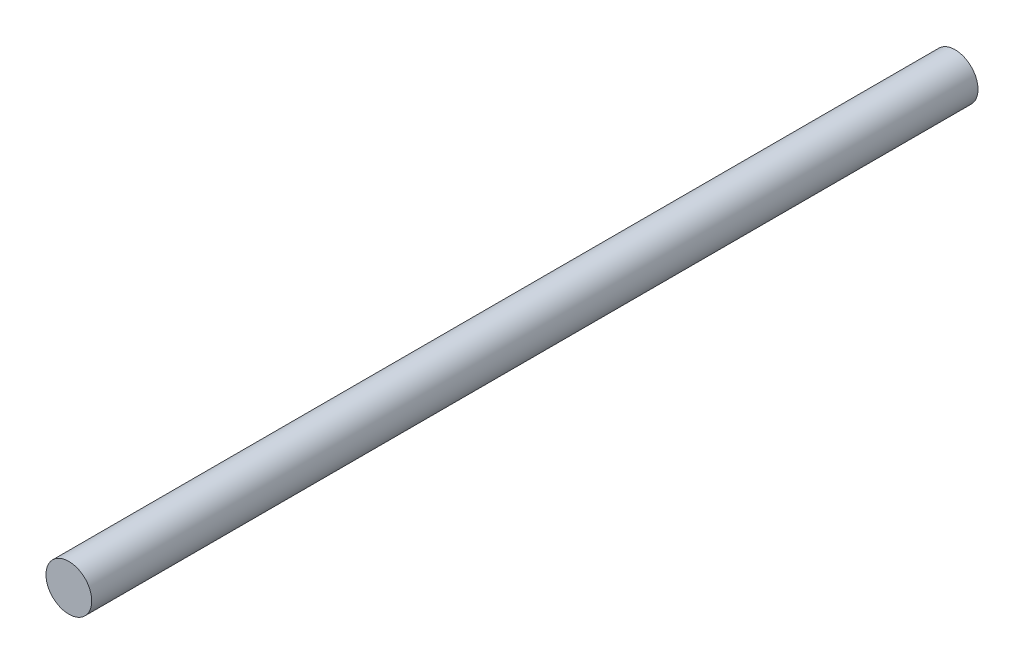
ISO-10303-21;
HEADER;
FILE_DESCRIPTION(('STEP AP214'),'2;1');
FILE_NAME('part.step','',(''),(''),'','','');
FILE_SCHEMA(('AUTOMOTIVE_DESIGN { 1 0 10303 214 1 1 1 1 }'));
ENDSEC;
DATA;
#1=APPLICATION_CONTEXT('core data for automotive mechanical design processes');
#2=APPLICATION_PROTOCOL_DEFINITION('international standard','automotive_design',2000,#1);
#3=PRODUCT_CONTEXT('',#1,'mechanical');
#4=PRODUCT('Part','Part','',(#3));
#5=PRODUCT_RELATED_PRODUCT_CATEGORY('part','',(#4));
#6=PRODUCT_DEFINITION_FORMATION('','',#4);
#7=PRODUCT_DEFINITION_CONTEXT('part definition',#1,'design');
#8=PRODUCT_DEFINITION('design','',#6,#7);
#9=PRODUCT_DEFINITION_SHAPE('','',#8);
#10=(LENGTH_UNIT() NAMED_UNIT(*) SI_UNIT(.MILLI.,.METRE.));
#11=(NAMED_UNIT(*) PLANE_ANGLE_UNIT() SI_UNIT($,.RADIAN.));
#12=(NAMED_UNIT(*) SI_UNIT($,.STERADIAN.) SOLID_ANGLE_UNIT());
#13=UNCERTAINTY_MEASURE_WITH_UNIT(LENGTH_MEASURE(1.E-05),#10,'distance_accuracy_value','');
#14=(GEOMETRIC_REPRESENTATION_CONTEXT(3) GLOBAL_UNCERTAINTY_ASSIGNED_CONTEXT((#13)) GLOBAL_UNIT_ASSIGNED_CONTEXT((#10,
#11,#12)) REPRESENTATION_CONTEXT('',''));
#15=CARTESIAN_POINT('',(0.,0.,0.));
#16=DIRECTION('',(0.,0.,1.));
#17=DIRECTION('',(1.,0.,0.));
#18=AXIS2_PLACEMENT_3D('',#15,#16,#17);
#19=CARTESIAN_POINT('',(-44.558907258765,16.2139494473853,1200.));
#20=DIRECTION('',(0.,0.,-1.));
#21=DIRECTION('',(-1.,0.,0.));
#22=AXIS2_PLACEMENT_3D('',#19,#20,#21);
#23=CYLINDRICAL_SURFACE('',#22,31.);
#24=CARTESIAN_POINT('',(-44.558907258765,16.2139494473853,1200.));
#25=DIRECTION('',(0.,0.,1.));
#26=DIRECTION('',(1.,0.,0.));
#27=AXIS2_PLACEMENT_3D('',#24,#25,#26);
#28=CIRCLE('',#27,31.);
#29=CARTESIAN_POINT('',(-13.558907258765,16.2139494473853,1200.));
#30=VERTEX_POINT('',#29);
#31=EDGE_CURVE('E10',#30,#30,#28,.T.);
#32=ORIENTED_EDGE('',*,*,#31,.F.);
#33=EDGE_LOOP('',(#32));
#34=FACE_BOUND('',#33,.T.);
#35=CARTESIAN_POINT('',(-44.558907258765,16.2139494473853,0.));
#36=DIRECTION('',(0.,0.,1.));
#37=DIRECTION('',(1.,0.,0.));
#38=AXIS2_PLACEMENT_3D('',#35,#36,#37);
#39=CIRCLE('',#38,31.);
#40=CARTESIAN_POINT('',(-13.558907258765,16.2139494473853,0.));
#41=VERTEX_POINT('',#40);
#42=EDGE_CURVE('E34',#41,#41,#39,.T.);
#43=ORIENTED_EDGE('',*,*,#42,.T.);
#44=EDGE_LOOP('',(#43));
#45=FACE_BOUND('',#44,.T.);
#46=ADVANCED_FACE('F31',(#34,#45),#23,.T.);
#47=CARTESIAN_POINT('',(-44.558907258765,16.2139494473853,1200.));
#48=DIRECTION('',(0.,0.,1.));
#49=DIRECTION('',(1.,0.,0.));
#50=AXIS2_PLACEMENT_3D('',#47,#48,#49);
#51=PLANE('',#50);
#52=ORIENTED_EDGE('',*,*,#31,.T.);
#53=EDGE_LOOP('',(#52));
#54=FACE_BOUND('',#53,.T.);
#55=ADVANCED_FACE('F46',(#54),#51,.T.);
#56=CARTESIAN_POINT('',(-44.558907258765,16.2139494473853,0.));
#57=DIRECTION('',(0.,0.,1.));
#58=DIRECTION('',(1.,0.,0.));
#59=AXIS2_PLACEMENT_3D('',#56,#57,#58);
#60=PLANE('',#59);
#61=ORIENTED_EDGE('',*,*,#42,.F.);
#62=EDGE_LOOP('',(#61));
#63=FACE_BOUND('',#62,.T.);
#64=ADVANCED_FACE('F44',(#63),#60,.F.);
#65=CLOSED_SHELL('',(#46,#55,#64));
#66=MANIFOLD_SOLID_BREP('B2',#65);
#67=ADVANCED_BREP_SHAPE_REPRESENTATION('',(#18,#66),#14);
#68=SHAPE_DEFINITION_REPRESENTATION(#9,#67);
ENDSEC;
END-ISO-10303-21;
